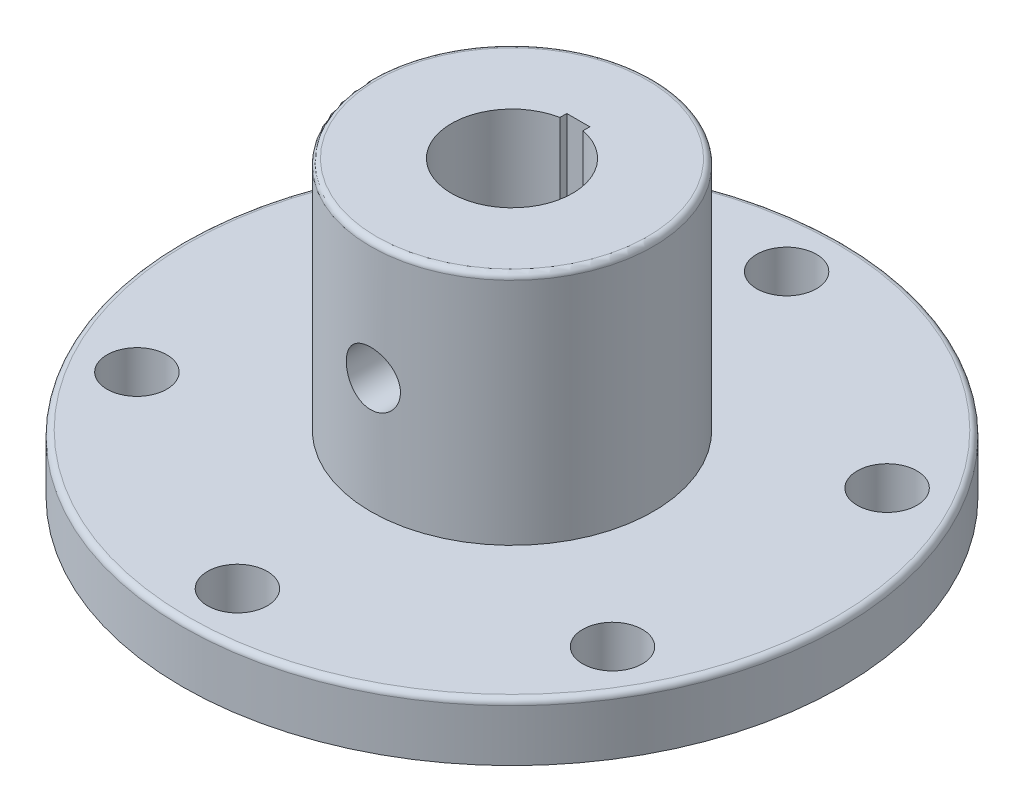
ISO-10303-21;
HEADER;
FILE_DESCRIPTION(('STEP AP214'),'2;1');
FILE_NAME('part.step','',(''),(''),'','','');
FILE_SCHEMA(('AUTOMOTIVE_DESIGN { 1 0 10303 214 1 1 1 1 }'));
ENDSEC;
DATA;
#1=APPLICATION_CONTEXT('core data for automotive mechanical design processes');
#2=APPLICATION_PROTOCOL_DEFINITION('international standard','automotive_design',2000,#1);
#3=PRODUCT_CONTEXT('',#1,'mechanical');
#4=PRODUCT('Part','Part','',(#3));
#5=PRODUCT_RELATED_PRODUCT_CATEGORY('part','',(#4));
#6=PRODUCT_DEFINITION_FORMATION('','',#4);
#7=PRODUCT_DEFINITION_CONTEXT('part definition',#1,'design');
#8=PRODUCT_DEFINITION('design','',#6,#7);
#9=PRODUCT_DEFINITION_SHAPE('','',#8);
#10=(LENGTH_UNIT() NAMED_UNIT(*) SI_UNIT(.MILLI.,.METRE.));
#11=(NAMED_UNIT(*) PLANE_ANGLE_UNIT() SI_UNIT($,.RADIAN.));
#12=(NAMED_UNIT(*) SI_UNIT($,.STERADIAN.) SOLID_ANGLE_UNIT());
#13=UNCERTAINTY_MEASURE_WITH_UNIT(LENGTH_MEASURE(1.E-05),#10,'distance_accuracy_value','');
#14=(GEOMETRIC_REPRESENTATION_CONTEXT(3) GLOBAL_UNCERTAINTY_ASSIGNED_CONTEXT((#13)) GLOBAL_UNIT_ASSIGNED_CONTEXT((#10,
#11,#12)) REPRESENTATION_CONTEXT('',''));
#15=CARTESIAN_POINT('',(0.,0.,0.));
#16=DIRECTION('',(0.,0.,1.));
#17=DIRECTION('',(1.,0.,0.));
#18=AXIS2_PLACEMENT_3D('',#15,#16,#17);
#19=CARTESIAN_POINT('',(0.,25.4,0.));
#20=DIRECTION('',(0.,-1.,0.));
#21=DIRECTION('',(0.,0.,-1.));
#22=AXIS2_PLACEMENT_3D('',#19,#20,#21);
#23=CYLINDRICAL_SURFACE('',#22,5.25);
#24=CARTESIAN_POINT('',(-2.3495,15.,4.69492808784118));
#25=CARTESIAN_POINT('',(-2.34949288735421,14.8756945065325,4.694935836284));
#26=CARTESIAN_POINT('',(-2.33957132215159,14.7511862497372,4.69993720821761));
#27=CARTESIAN_POINT('',(-2.3003208765193,14.5058455843325,4.71926659332286));
#28=CARTESIAN_POINT('',(-2.27094321450493,14.3850232157904,4.73361804815298));
#29=CARTESIAN_POINT('',(-2.19419994467508,14.1510444450422,4.76967068579204));
#30=CARTESIAN_POINT('',(-2.14691533883563,14.0378561869069,4.7913387249291));
#31=CARTESIAN_POINT('',(-2.03594368812667,13.8210479822122,4.83953301093363));
#32=CARTESIAN_POINT('',(-1.97225878555762,13.7174267883482,4.86605862314654));
#33=CARTESIAN_POINT('',(-1.82539310349536,13.5151730991631,4.92311210088569));
#34=CARTESIAN_POINT('',(-1.74120962848836,13.4173101616223,4.95378826214694));
#35=CARTESIAN_POINT('',(-1.55783507534765,13.236512161064,5.01447658382264));
#36=CARTESIAN_POINT('',(-1.45863770139583,13.1535833925281,5.04448845960026));
#37=CARTESIAN_POINT('',(-1.241800603619,13.0008637463092,5.10231707238847));
#38=CARTESIAN_POINT('',(-1.12347502920796,12.9319672225833,5.12994169594584));
#39=CARTESIAN_POINT('',(-0.875449781211427,12.8153982259397,5.17803092931463));
#40=CARTESIAN_POINT('',(-0.745755935130169,12.767714954153,5.19849918102714));
#41=CARTESIAN_POINT('',(-0.486782719503627,12.6978042742629,5.22891234419675));
#42=CARTESIAN_POINT('',(-0.357929561478004,12.674242019914,5.23940644757788));
#43=CARTESIAN_POINT('',(-0.0977009822254734,12.6488998652787,5.25070321989438));
#44=CARTESIAN_POINT('',(0.0336732175401929,12.6471096704811,5.25151046907518));
#45=CARTESIAN_POINT('',(0.285395750012746,12.664726801271,5.24364431860405));
#46=CARTESIAN_POINT('',(0.4058720800966,12.6826588456921,5.23563071022895));
#47=CARTESIAN_POINT('',(0.641893703788537,12.7366438424558,5.21196168535084));
#48=CARTESIAN_POINT('',(0.75743863136576,12.7726981373842,5.19630570266543));
#49=CARTESIAN_POINT('',(0.982458808102356,12.8622862290396,5.15853665572203));
#50=CARTESIAN_POINT('',(1.09181495172675,12.9160776421955,5.13632896679957));
#51=CARTESIAN_POINT('',(1.3002354218741,13.0393338719513,5.08756926348823));
#52=CARTESIAN_POINT('',(1.39929597064186,13.1088044122359,5.06101566359456));
#53=CARTESIAN_POINT('',(1.59269359144384,13.2678420471255,5.00367797653522));
#54=CARTESIAN_POINT('',(1.68602925145679,13.3585676618148,4.9727253911028));
#55=CARTESIAN_POINT('',(1.85663478954122,13.5543410692201,4.91158194533386));
#56=CARTESIAN_POINT('',(1.93389645399695,13.6593961389427,4.88139148132126));
#57=CARTESIAN_POINT('',(2.07331422226228,13.8864454154257,4.82387892304089));
#58=CARTESIAN_POINT('',(2.1346839325573,14.0089715667011,4.79673448354417));
#59=CARTESIAN_POINT('',(2.2354975655461,14.264148375657,4.75059570094461));
#60=CARTESIAN_POINT('',(2.27495992140187,14.3967904144606,4.73159450907578));
#61=CARTESIAN_POINT('',(2.32808071537848,14.6583734014502,4.70567311718695));
#62=CARTESIAN_POINT('',(2.34337860371551,14.7869037414304,4.69798802469881));
#63=CARTESIAN_POINT('',(2.35261012821264,15.0448974312917,4.69337448662132));
#64=CARTESIAN_POINT('',(2.34655327634646,15.1743603401432,4.6964412518629));
#65=CARTESIAN_POINT('',(2.31474827981582,15.4197506687006,4.71218643144925));
#66=CARTESIAN_POINT('',(2.29058936135858,15.5359408118542,4.72408843297877));
#67=CARTESIAN_POINT('',(2.2254595091983,15.762482694797,4.75511525761755));
#68=CARTESIAN_POINT('',(2.18448421775782,15.8728329128738,4.77424195280688));
#69=CARTESIAN_POINT('',(2.08487033035258,16.0901344618703,4.81859997319486));
#70=CARTESIAN_POINT('',(2.02552044748815,16.1967099431628,4.8440670911214));
#71=CARTESIAN_POINT('',(1.89151477557983,16.3989472133058,4.89794682062964));
#72=CARTESIAN_POINT('',(1.81685173001891,16.4946037943934,4.92636082549865));
#73=CARTESIAN_POINT('',(1.64586484024666,16.6819242137616,4.98624028882396));
#74=CARTESIAN_POINT('',(1.54814539732807,16.7723100749705,5.01773540834785));
#75=CARTESIAN_POINT('',(1.33825838275017,16.9356913028539,5.07774245142922));
#76=CARTESIAN_POINT('',(1.22608864695995,17.0086840599952,5.10625392698334));
#77=CARTESIAN_POINT('',(0.988751780791553,17.1355992543858,5.15749211271813));
#78=CARTESIAN_POINT('',(0.863473251487309,17.1893376036745,5.18016242852228));
#79=CARTESIAN_POINT('',(0.604362427400938,17.2745238931534,5.21673415126384));
#80=CARTESIAN_POINT('',(0.470536162434202,17.3059873614161,5.23064166610372));
#81=CARTESIAN_POINT('',(0.20945668062214,17.3435636876852,5.24732191408229));
#82=CARTESIAN_POINT('',(0.0825106559601721,17.351470567749,5.25088209841407));
#83=CARTESIAN_POINT('',(-0.1708990944023,17.3466980635875,5.24874587072025));
#84=CARTESIAN_POINT('',(-0.297362923085681,17.3340233540928,5.24305156068298));
#85=CARTESIAN_POINT('',(-0.540243353733003,17.2897249361331,5.22348775952621));
#86=CARTESIAN_POINT('',(-0.656855387949585,17.2589883299171,5.21000145824094));
#87=CARTESIAN_POINT('',(-0.883173870332101,17.1804835853633,5.17644691877276));
#88=CARTESIAN_POINT('',(-0.992879115257439,17.1327124890319,5.15637753750418));
#89=CARTESIAN_POINT('',(-1.20783955943962,17.0190905291212,5.11040687615306));
#90=CARTESIAN_POINT('',(-1.31266050422853,16.9525115161349,5.08428050525377));
#91=CARTESIAN_POINT('',(-1.5101030896888,16.8041634373944,5.0291761594647));
#92=CARTESIAN_POINT('',(-1.60271948416682,16.7223878754874,5.00019696756447));
#93=CARTESIAN_POINT('',(-1.78086799284568,16.5382918436735,4.93969179058311));
#94=CARTESIAN_POINT('',(-1.86524131125446,16.4348513804013,4.90814746291068));
#95=CARTESIAN_POINT('',(-2.01569191677081,16.2144802911315,4.84830462271413));
#96=CARTESIAN_POINT('',(-2.08175759503139,16.097541171917,4.82000817629702));
#97=CARTESIAN_POINT('',(-2.19369292295969,15.8521059033302,4.77011817271552));
#98=CARTESIAN_POINT('',(-2.23945891552778,15.7235543819909,4.74855918084805));
#99=CARTESIAN_POINT('',(-2.29095501308678,15.5256739075768,4.72380863770945));
#100=CARTESIAN_POINT('',(-2.30525619630081,15.4589361239713,4.71682610025299));
#101=CARTESIAN_POINT('',(-2.32801563914606,15.3242580521732,4.70563600330551));
#102=CARTESIAN_POINT('',(-2.33647827232849,15.2563187032652,4.70142636679222));
#103=CARTESIAN_POINT('',(-2.34446983294463,15.1568347671213,4.69744267166463));
#104=CARTESIAN_POINT('',(-2.34635491293909,15.1255064323804,4.69650111565107));
#105=CARTESIAN_POINT('',(-2.34887091356664,15.0627897126429,4.69524283572856));
#106=CARTESIAN_POINT('',(-2.34950179675493,15.0314013258814,4.69492613047492));
#107=CARTESIAN_POINT('',(-2.3495,15.,4.69492808784118));
#108=B_SPLINE_CURVE_WITH_KNOTS('',3,(#24,#25,#26,#27,#28,#29,#30,#31,#32,#33,#34,#35,#36,#37,
#38,#39,#40,#41,#42,#43,#44,#45,#46,#47,#48,#49,#50,#51,#52,#53,#54,#55,#56,#57,#58,#59,#60,#61,
#62,#63,#64,#65,#66,#67,#68,#69,#70,#71,#72,#73,#74,#75,#76,#77,#78,#79,#80,#81,#82,#83,#84,#85,
#86,#87,#88,#89,#90,#91,#92,#93,#94,#95,#96,#97,#98,#99,#100,#101,#102,#103,#104,#105,#106,
#107),.UNSPECIFIED.,.T.,.F.,(4,2,2,2,2,2,2,2,2,2,2,2,2,2,2,2,2,2,2,2,2,2,2,2,2,2,2,2,2,2,2,2,2,
2,2,2,2,2,2,2,2,4),(0.,0.372790612810976,0.746519466956936,1.11857757156697,1.49058710045243,
1.88692790767571,2.28343537637688,2.70032281423636,3.11699778685185,3.50911129629917,
3.90103939499522,4.26552828520791,4.6300441825409,5.00010646164806,5.37030405157852,
5.76992888154144,6.16975741607203,6.58666812768393,7.00322751089224,7.390081146283,
7.77676248846835,8.1329744145174,8.48927870645142,8.86160173198539,9.23410160124911,
9.64257920582375,10.0511180568335,10.4634647349479,10.8755236777104,11.2552786865922,
11.6349474531562,11.9973661661113,12.3598478427755,12.7389391856741,13.1181929551811,
13.527775050221,13.9376162694368,14.349526839408,14.5550991295318,14.7605172615214,
14.8546866317904,14.9488588135007),.UNSPECIFIED.);
#109=CARTESIAN_POINT('',(-2.3495,15.,4.69492808784118));
#110=VERTEX_POINT('',#109);
#111=EDGE_CURVE('E217',#110,#110,#108,.T.);
#112=ORIENTED_EDGE('',*,*,#111,.T.);
#113=EDGE_LOOP('',(#112));
#114=FACE_BOUND('',#113,.T.);
#115=DIRECTION('',(0.,-1.,0.));
#116=VECTOR('',#115,1.);
#117=CARTESIAN_POINT('',(-1.,25.4,-5.15388203202208));
#118=LINE('',#117,#116);
#119=CARTESIAN_POINT('',(-0.99999999999999,12.8739355019191,-5.15388203202208));
#120=VERTEX_POINT('',#119);
#121=CARTESIAN_POINT('',(-1.,0.,-5.15388203202208));
#122=VERTEX_POINT('',#121);
#123=EDGE_CURVE('E131',#120,#122,#118,.T.);
#124=ORIENTED_EDGE('',*,*,#123,.F.);
#125=CARTESIAN_POINT('',(-1.,12.8739355019191,-5.15388203202208));
#126=CARTESIAN_POINT('',(-1.06119947936619,12.9027227539271,-5.14201147854939));
#127=CARTESIAN_POINT('',(-1.12097908357932,12.9340665085816,-5.12927685115682));
#128=CARTESIAN_POINT('',(-1.23737961800917,13.0016075654945,-5.10244559622488));
#129=CARTESIAN_POINT('',(-1.29400173593585,13.037803025073,-5.08834948634239));
#130=CARTESIAN_POINT('',(-1.45859199486861,13.1532227104732,-5.04458761024607));
#131=CARTESIAN_POINT('',(-1.56143017186008,13.239349509596,-5.01341851219442));
#132=CARTESIAN_POINT('',(-1.7507970708801,13.4275210813298,-4.95047383171912));
#133=CARTESIAN_POINT('',(-1.83733952997427,13.5295523128802,-4.91869878521529));
#134=CARTESIAN_POINT('',(-1.99225279735714,13.747430315286,-4.85801961282309));
#135=CARTESIAN_POINT('',(-2.06062133259279,13.8632788116749,-4.82911584633498));
#136=CARTESIAN_POINT('',(-2.17729457913239,14.1067778190515,-4.7776561958054));
#137=CARTESIAN_POINT('',(-2.22549918729212,14.2344834549723,-4.75513215798233));
#138=CARTESIAN_POINT('',(-2.2991943682828,14.4975459934541,-4.71994821876514));
#139=CARTESIAN_POINT('',(-2.32470848644083,14.6328948093696,-4.70727809394145));
#140=CARTESIAN_POINT('',(-2.35041408286915,14.8938293591678,-4.69448944012305));
#141=CARTESIAN_POINT('',(-2.3527352336999,15.0191559111061,-4.6933155061049));
#142=CARTESIAN_POINT('',(-2.33746608805249,15.2682681011146,-4.70093867193292));
#143=CARTESIAN_POINT('',(-2.31987790643108,15.3920539014383,-4.70973471272471));
#144=CARTESIAN_POINT('',(-2.2669493790213,15.6285584337893,-4.73542383745824));
#145=CARTESIAN_POINT('',(-2.23249495127255,15.7415234496782,-4.75191108288829));
#146=CARTESIAN_POINT('',(-2.14756124638246,15.9601547554637,-4.79089289169742));
#147=CARTESIAN_POINT('',(-2.09707532227938,16.0658179957398,-4.81338994624181));
#148=CARTESIAN_POINT('',(-1.97707623073182,16.2755425098824,-4.86397074217414));
#149=CARTESIAN_POINT('',(-1.90640766948998,16.37887027536,-4.89234930620746));
#150=CARTESIAN_POINT('',(-1.74985899682494,16.5727928263031,-4.95050160527635));
#151=CARTESIAN_POINT('',(-1.66397975065314,16.6633883355103,-4.98027526088209));
#152=CARTESIAN_POINT('',(-1.48646351135146,16.8230739626907,-5.03595061567414));
#153=CARTESIAN_POINT('',(-1.39591039314018,16.8933294948501,-5.06196779558557));
#154=CARTESIAN_POINT('',(-1.20496027568672,17.0202459517289,-5.11081313146886));
#155=CARTESIAN_POINT('',(-1.10456254173413,17.0769058607083,-5.13364104911514));
#156=CARTESIAN_POINT('',(-1.,17.1260644980809,-5.15388203202207));
#157=B_SPLINE_CURVE_WITH_KNOTS('',3,(#125,#126,#127,#128,#129,#130,#131,#132,#133,#134,#135,
#136,#137,#138,#139,#140,#141,#142,#143,#144,#145,#146,#147,#148,#149,#150,#151,#152,#153,#154,
#155,#156),.UNSPECIFIED.,.F.,.F.,(4,2,2,2,2,2,2,2,2,2,2,2,2,2,2,4),(0.,0.205848645301979,
0.411619329551637,0.822673855865901,1.23338030219207,1.64413809234327,2.05691154502545,
2.46925617204709,2.84334613156665,3.21739635733607,3.5736212982832,3.92999413010564,
4.31348049971195,4.69694506191016,5.04830777223863,5.39969672499349),.UNSPECIFIED.);
#158=CARTESIAN_POINT('',(-1.,17.1260644980809,-5.15388203202208));
#159=VERTEX_POINT('',#158);
#160=EDGE_CURVE('E113',#120,#159,#157,.T.);
#161=ORIENTED_EDGE('',*,*,#160,.T.);
#162=CARTESIAN_POINT('',(-1.,25.4,-5.15388203202208));
#163=VERTEX_POINT('',#162);
#164=EDGE_CURVE('E111',#163,#159,#118,.T.);
#165=ORIENTED_EDGE('',*,*,#164,.F.);
#166=CARTESIAN_POINT('',(0.,25.4,0.));
#167=DIRECTION('',(0.,1.,0.));
#168=DIRECTION('',(0.,0.,1.));
#169=AXIS2_PLACEMENT_3D('',#166,#167,#168);
#170=CIRCLE('',#169,5.25);
#171=CARTESIAN_POINT('',(0.999999999999999,25.4,-5.15388203202208));
#172=VERTEX_POINT('',#171);
#173=EDGE_CURVE('E134',#163,#172,#170,.T.);
#174=ORIENTED_EDGE('',*,*,#173,.T.);
#175=DIRECTION('',(0.,-1.,0.));
#176=VECTOR('',#175,1.);
#177=CARTESIAN_POINT('',(0.999999999999999,25.4,-5.15388203202208));
#178=LINE('',#177,#176);
#179=CARTESIAN_POINT('',(1.,17.1260644980809,-5.15388203202208));
#180=VERTEX_POINT('',#179);
#181=EDGE_CURVE('E122',#180,#172,#178,.F.);
#182=ORIENTED_EDGE('',*,*,#181,.F.);
#183=CARTESIAN_POINT('',(0.999999999999999,17.1260644980809,-5.15388203202208));
#184=CARTESIAN_POINT('',(1.06119947936619,17.0972772460729,-5.14201147854939));
#185=CARTESIAN_POINT('',(1.12097908357931,17.0659334914184,-5.12927685115683));
#186=CARTESIAN_POINT('',(1.23737961800916,16.9983924345055,-5.10244559622488));
#187=CARTESIAN_POINT('',(1.29400173593584,16.962196974927,-5.08834948634239));
#188=CARTESIAN_POINT('',(1.4585919948686,16.8467772895268,-5.04458761024607));
#189=CARTESIAN_POINT('',(1.56143017186007,16.760650490404,-5.01341851219442));
#190=CARTESIAN_POINT('',(1.7507970708801,16.5724789186702,-4.95047383171912));
#191=CARTESIAN_POINT('',(1.83733952997426,16.4704476871198,-4.91869878521529));
#192=CARTESIAN_POINT('',(1.99225279735714,16.252569684714,-4.8580196128231));
#193=CARTESIAN_POINT('',(2.06062133259279,16.1367211883251,-4.82911584633498));
#194=CARTESIAN_POINT('',(2.17729457913239,15.8932221809485,-4.7776561958054));
#195=CARTESIAN_POINT('',(2.22549918729212,15.7655165450277,-4.75513215798233));
#196=CARTESIAN_POINT('',(2.2991943682828,15.5024540065459,-4.71994821876514));
#197=CARTESIAN_POINT('',(2.32470848644083,15.3671051906304,-4.70727809394145));
#198=CARTESIAN_POINT('',(2.35041408286915,15.1061706408322,-4.69448944012305));
#199=CARTESIAN_POINT('',(2.3527352336999,14.9808440888939,-4.6933155061049));
#200=CARTESIAN_POINT('',(2.33746608805249,14.7317318988854,-4.70093867193292));
#201=CARTESIAN_POINT('',(2.31987790643109,14.6079460985617,-4.70973471272471));
#202=CARTESIAN_POINT('',(2.2669493790213,14.3714415662108,-4.73542383745824));
#203=CARTESIAN_POINT('',(2.23249495127255,14.2584765503218,-4.75191108288829));
#204=CARTESIAN_POINT('',(2.14756124638246,14.0398452445363,-4.79089289169742));
#205=CARTESIAN_POINT('',(2.09707532227939,13.9341820042602,-4.81338994624181));
#206=CARTESIAN_POINT('',(1.97707623073182,13.7244574901176,-4.86397074217414));
#207=CARTESIAN_POINT('',(1.90640766948999,13.62112972464,-4.89234930620746));
#208=CARTESIAN_POINT('',(1.74985899682495,13.4272071736969,-4.95050160527634));
#209=CARTESIAN_POINT('',(1.66397975065315,13.3366116644897,-4.98027526088209));
#210=CARTESIAN_POINT('',(1.48646351135146,13.1769260373093,-5.03595061567413));
#211=CARTESIAN_POINT('',(1.39591039314019,13.1066705051499,-5.06196779558557));
#212=CARTESIAN_POINT('',(1.20496027568672,12.9797540482711,-5.11081313146886));
#213=CARTESIAN_POINT('',(1.10456254173413,12.9230941392917,-5.13364104911514));
#214=CARTESIAN_POINT('',(1.,12.8739355019191,-5.15388203202208));
#215=B_SPLINE_CURVE_WITH_KNOTS('',3,(#183,#184,#185,#186,#187,#188,#189,#190,#191,#192,#193,
#194,#195,#196,#197,#198,#199,#200,#201,#202,#203,#204,#205,#206,#207,#208,#209,#210,#211,#212,
#213,#214),.UNSPECIFIED.,.F.,.F.,(4,2,2,2,2,2,2,2,2,2,2,2,2,2,2,4),(0.,0.205848645301976,
0.411619329551632,0.8226738558659,1.23338030219206,1.64413809234327,2.05691154502546,
2.46925617204709,2.84334613156665,3.21739635733607,3.5736212982832,3.92999413010564,
4.31348049971195,4.69694506191015,5.04830777223863,5.3996967249935),.UNSPECIFIED.);
#216=CARTESIAN_POINT('',(0.999999999999999,12.8739355019191,-5.15388203202208));
#217=VERTEX_POINT('',#216);
#218=EDGE_CURVE('E103',#180,#217,#215,.T.);
#219=ORIENTED_EDGE('',*,*,#218,.T.);
#220=CARTESIAN_POINT('',(0.999999999999999,0.,-5.15388203202208));
#221=VERTEX_POINT('',#220);
#222=EDGE_CURVE('E128',#221,#217,#178,.F.);
#223=ORIENTED_EDGE('',*,*,#222,.F.);
#224=CARTESIAN_POINT('',(0.,0.,0.));
#225=DIRECTION('',(0.,1.,0.));
#226=DIRECTION('',(0.,0.,1.));
#227=AXIS2_PLACEMENT_3D('',#224,#225,#226);
#228=CIRCLE('',#227,5.25);
#229=EDGE_CURVE('E133',#122,#221,#228,.T.);
#230=ORIENTED_EDGE('',*,*,#229,.F.);
#231=EDGE_LOOP('',(#124,#161,#165,#174,#182,#219,#223,#230));
#232=FACE_BOUND('',#231,.T.);
#233=ADVANCED_FACE('F35',(#114,#232),#23,.F.);
#234=CARTESIAN_POINT('',(0.,25.4,0.));
#235=DIRECTION('',(0.,-1.,0.));
#236=DIRECTION('',(0.,0.,-1.));
#237=AXIS2_PLACEMENT_3D('',#234,#235,#236);
#238=CYLINDRICAL_SURFACE('',#237,12.25);
#239=CARTESIAN_POINT('',(0.,5.,0.));
#240=DIRECTION('',(0.,1.,0.));
#241=DIRECTION('',(0.,0.,1.));
#242=AXIS2_PLACEMENT_3D('',#239,#240,#241);
#243=CIRCLE('',#242,12.25);
#244=CARTESIAN_POINT('',(0.,5.,12.25));
#245=VERTEX_POINT('',#244);
#246=EDGE_CURVE('E140',#245,#245,#243,.T.);
#247=ORIENTED_EDGE('',*,*,#246,.T.);
#248=EDGE_LOOP('',(#247));
#249=FACE_BOUND('',#248,.T.);
#250=CARTESIAN_POINT('',(0.,24.9,0.));
#251=DIRECTION('',(0.,1.,0.));
#252=DIRECTION('',(0.,0.,1.));
#253=AXIS2_PLACEMENT_3D('',#250,#251,#252);
#254=CIRCLE('',#253,12.25);
#255=CARTESIAN_POINT('',(0.,24.9,12.25));
#256=VERTEX_POINT('',#255);
#257=EDGE_CURVE('E184',#256,#256,#254,.F.);
#258=ORIENTED_EDGE('',*,*,#257,.T.);
#259=EDGE_LOOP('',(#258));
#260=FACE_BOUND('',#259,.T.);
#261=CARTESIAN_POINT('',(-2.3495,15.,12.0225766685016));
#262=CARTESIAN_POINT('',(-2.34949504698664,14.8693364651433,12.0225792241852));
#263=CARTESIAN_POINT('',(-2.33856305282083,14.7386093107103,12.0247299218017));
#264=CARTESIAN_POINT('',(-2.29515573714834,14.4808452306569,12.033088976524));
#265=CARTESIAN_POINT('',(-2.26266248998512,14.353811467465,12.0393007098419));
#266=CARTESIAN_POINT('',(-2.17717063830551,14.107200938487,12.055053023297));
#267=CARTESIAN_POINT('',(-2.12419156994162,13.987617193821,12.0645904310808));
#268=CARTESIAN_POINT('',(-1.99928430173027,13.759041346225,12.0859157073137));
#269=CARTESIAN_POINT('',(-1.92735743815879,13.6500484971235,12.0977034170462));
#270=CARTESIAN_POINT('',(-1.76559840924849,13.4443224171205,12.1223725031353));
#271=CARTESIAN_POINT('',(-1.67556711823386,13.3477470689677,12.1352650355335));
#272=CARTESIAN_POINT('',(-1.48058520816786,13.170973928605,12.160592687512));
#273=CARTESIAN_POINT('',(-1.37563358845673,13.0907772357399,12.1730277763427));
#274=CARTESIAN_POINT('',(-1.1527503121814,12.9484303044636,12.1961592296116));
#275=CARTESIAN_POINT('',(-1.03472167652221,12.8864293235055,12.2068409131456));
#276=CARTESIAN_POINT('',(-0.789683845985917,12.7831959247974,12.2251369948476));
#277=CARTESIAN_POINT('',(-0.66267542485647,12.7419617201489,12.2327516569092));
#278=CARTESIAN_POINT('',(-0.404920240013073,12.6819216824556,12.2439769265667));
#279=CARTESIAN_POINT('',(-0.274237612303616,12.662849539046,12.2476350402121));
#280=CARTESIAN_POINT('',(-0.0114796867264842,12.6468448605073,12.2506988955152));
#281=CARTESIAN_POINT('',(0.120595486248741,12.6499103565164,12.2501050153336));
#282=CARTESIAN_POINT('',(0.380561820512192,12.6778904563441,12.2447688162567));
#283=CARTESIAN_POINT('',(0.508485128158225,12.7025182736422,12.2400809508762));
#284=CARTESIAN_POINT('',(0.758349125238763,12.7724699059771,12.2271446984939));
#285=CARTESIAN_POINT('',(0.880289589085308,12.8177945007395,12.2188961773493));
#286=CARTESIAN_POINT('',(1.11555368673449,12.9281237871392,12.1996748346488));
#287=CARTESIAN_POINT('',(1.22882258496071,12.9932423498107,12.1886863179338));
#288=CARTESIAN_POINT('',(1.44293233547798,13.1412270726457,12.1651989091385));
#289=CARTESIAN_POINT('',(1.54377186589846,13.2240951179158,12.1526998566912));
#290=CARTESIAN_POINT('',(1.73186054769819,13.4068044706307,12.1273379340086));
#291=CARTESIAN_POINT('',(1.81886576308396,13.5068967106134,12.1144724439169));
#292=CARTESIAN_POINT('',(1.97489266921171,13.7203793656276,12.0900188122153));
#293=CARTESIAN_POINT('',(2.04391407208373,13.8337699934866,12.078430691054));
#294=CARTESIAN_POINT('',(2.16208852680736,14.0709631530007,12.0578395721108));
#295=CARTESIAN_POINT('',(2.21120477054063,14.1947844669451,12.0488413723659));
#296=CARTESIAN_POINT('',(2.28786658965913,14.4491337151027,12.0345212859664));
#297=CARTESIAN_POINT('',(2.31541473186798,14.5796608492843,12.029198961854));
#298=CARTESIAN_POINT('',(2.34779936844694,14.841513091968,12.0229201592954));
#299=CARTESIAN_POINT('',(2.35298693113591,14.9727932099801,12.0218962018551));
#300=CARTESIAN_POINT('',(2.34144544993629,15.2343435074448,12.0241493082128));
#301=CARTESIAN_POINT('',(2.32471754309492,15.3646137389411,12.0274261488713));
#302=CARTESIAN_POINT('',(2.27012178342351,15.619283512459,12.0378486643735));
#303=CARTESIAN_POINT('',(2.2324391632728,15.7437242775671,12.0449604233571));
#304=CARTESIAN_POINT('',(2.13720069889962,15.9845258418962,12.0622220643179));
#305=CARTESIAN_POINT('',(2.07964333122918,16.1008860208991,12.0723721791845));
#306=CARTESIAN_POINT('',(1.94548569521362,16.3237664809372,12.0947198380405));
#307=CARTESIAN_POINT('',(1.86866436030411,16.4301513261459,12.1069405753467));
#308=CARTESIAN_POINT('',(1.69845640912243,16.6286475258375,12.131987813097));
#309=CARTESIAN_POINT('',(1.60506823113931,16.7207575331355,12.1448143705663));
#310=CARTESIAN_POINT('',(1.40280684840802,16.889407531105,12.1698455890914));
#311=CARTESIAN_POINT('',(1.29373480180205,16.9657109864034,12.1820390024736));
#312=CARTESIAN_POINT('',(1.0641158064415,17.0989097227653,12.20423870684));
#313=CARTESIAN_POINT('',(0.943569313766694,17.1558057748115,12.2142450847013));
#314=CARTESIAN_POINT('',(0.69506613015431,17.248223678139,12.2308950149354));
#315=CARTESIAN_POINT('',(0.567153279998392,17.2838600306363,12.2375565507379));
#316=CARTESIAN_POINT('',(0.307017610252305,17.3331115152568,12.2468430796185));
#317=CARTESIAN_POINT('',(0.174795267810497,17.3467290769148,12.2494685180346));
#318=CARTESIAN_POINT('',(-0.0879407808491681,17.3514686325634,12.2503776168174));
#319=CARTESIAN_POINT('',(-0.218447947420502,17.3429473221828,12.248730122283));
#320=CARTESIAN_POINT('',(-0.476134132608787,17.3044343851998,12.2414220972256));
#321=CARTESIAN_POINT('',(-0.603313186357644,17.2744429853328,12.2357616090818));
#322=CARTESIAN_POINT('',(-0.850533082721782,17.193994334222,12.2210642485117));
#323=CARTESIAN_POINT('',(-0.970587232195124,17.1435767056755,12.2120339155548));
#324=CARTESIAN_POINT('',(-1.20058450591225,17.0237502894297,12.1915726476411));
#325=CARTESIAN_POINT('',(-1.31052691034202,16.9543401511267,12.1801415419729));
#326=CARTESIAN_POINT('',(-1.51895269892293,16.7972794830654,12.1559232185078));
#327=CARTESIAN_POINT('',(-1.61724048753996,16.7093720899143,12.1431183016167));
#328=CARTESIAN_POINT('',(-1.79779283923619,16.5183435694334,12.1177050023736));
#329=CARTESIAN_POINT('',(-1.88005362071752,16.4152188616169,12.1050966670494));
#330=CARTESIAN_POINT('',(-2.02697385060943,16.1954781797016,12.0813693249795));
#331=CARTESIAN_POINT('',(-2.09145375229001,16.0787404010185,12.0702660480508));
#332=CARTESIAN_POINT('',(-2.19978258078634,15.8359114686571,12.0509961636096));
#333=CARTESIAN_POINT('',(-2.24365072737532,15.7098291559908,12.0428268219824));
#334=CARTESIAN_POINT('',(-2.30073245479513,15.4861693708413,12.0320288085738));
#335=CARTESIAN_POINT('',(-2.31898848110147,15.3898903122715,12.0285056124419));
#336=CARTESIAN_POINT('',(-2.34337393002435,15.1957527081414,12.0237786192915));
#337=CARTESIAN_POINT('',(-2.34950371083889,15.0978942093224,12.0225747537622));
#338=CARTESIAN_POINT('',(-2.3495,15.,12.0225766685016));
#339=B_SPLINE_CURVE_WITH_KNOTS('',3,(#261,#262,#263,#264,#265,#266,#267,#268,#269,#270,#271,
#272,#273,#274,#275,#276,#277,#278,#279,#280,#281,#282,#283,#284,#285,#286,#287,#288,#289,#290,
#291,#292,#293,#294,#295,#296,#297,#298,#299,#300,#301,#302,#303,#304,#305,#306,#307,#308,#309,
#310,#311,#312,#313,#314,#315,#316,#317,#318,#319,#320,#321,#322,#323,#324,#325,#326,#327,#328,
#329,#330,#331,#332,#333,#334,#335,#336,#337,#338),.UNSPECIFIED.,.T.,.F.,(4,2,2,2,2,2,2,2,2,2,2,
2,2,2,2,2,2,2,2,2,2,2,2,2,2,2,2,2,2,2,2,2,2,2,2,2,2,2,4),(0.,0.391632295677845,
0.783590596367792,1.17517602711525,1.56673384904715,1.96286034105253,2.35901341256634,
2.75833065090976,3.15761352372043,3.55204710829349,3.94644561344126,4.33567683023969,
4.72492271205461,5.11645165008007,5.5080221915761,5.90587357477851,6.30373132606507,
6.7023214652825,7.10086416100226,7.49312627832594,7.88536804459639,8.27419641042213,
8.66305458751111,9.05659756046153,9.45017765136339,9.84927873922043,10.2483639704523,
10.6452799215645,11.0421520743167,11.4326697273817,11.8231832564375,12.2129428687986,
12.6027302051219,12.9983372160488,13.3940374583348,13.7935981229606,14.1927854675576,
14.486208315083,14.7796224950419),.UNSPECIFIED.);
#340=CARTESIAN_POINT('',(-2.3495,15.,12.0225766685016));
#341=VERTEX_POINT('',#340);
#342=EDGE_CURVE('E112',#341,#341,#339,.T.);
#343=ORIENTED_EDGE('',*,*,#342,.F.);
#344=EDGE_LOOP('',(#343));
#345=FACE_BOUND('',#344,.T.);
#346=ADVANCED_FACE('F267',(#249,#260,#345),#238,.T.);
#347=CARTESIAN_POINT('',(-1.,0.,-5.75));
#348=DIRECTION('',(-1.,0.,0.));
#349=DIRECTION('',(0.,0.,1.));
#350=AXIS2_PLACEMENT_3D('',#347,#348,#349);
#351=PLANE('',#350);
#352=DIRECTION('',(0.,0.,-1.));
#353=VECTOR('',#352,1.);
#354=CARTESIAN_POINT('',(-0.99999999999999,17.1260644980809,19.65));
#355=LINE('',#354,#353);
#356=CARTESIAN_POINT('',(-1.,17.1260644980809,-5.75));
#357=VERTEX_POINT('',#356);
#358=EDGE_CURVE('E98',#357,#159,#355,.F.);
#359=ORIENTED_EDGE('',*,*,#358,.F.);
#360=DIRECTION('',(0.,1.,0.));
#361=VECTOR('',#360,1.);
#362=CARTESIAN_POINT('',(-1.,0.,-5.75));
#363=LINE('',#362,#361);
#364=CARTESIAN_POINT('',(-1.,25.4,-5.75));
#365=VERTEX_POINT('',#364);
#366=EDGE_CURVE('E108',#357,#365,#363,.T.);
#367=ORIENTED_EDGE('',*,*,#366,.T.);
#368=DIRECTION('',(0.,0.,1.));
#369=VECTOR('',#368,1.);
#370=CARTESIAN_POINT('',(-1.,25.4,-5.75));
#371=LINE('',#370,#369);
#372=EDGE_CURVE('E216',#365,#163,#371,.T.);
#373=ORIENTED_EDGE('',*,*,#372,.T.);
#374=ORIENTED_EDGE('',*,*,#164,.T.);
#375=EDGE_LOOP('',(#359,#367,#373,#374));
#376=FACE_BOUND('',#375,.T.);
#377=ADVANCED_FACE('F107',(#376),#351,.F.);
#378=DIRECTION('',(0.,0.,-1.));
#379=VECTOR('',#378,1.);
#380=CARTESIAN_POINT('',(-0.99999999999999,12.8739355019191,19.65));
#381=LINE('',#380,#379);
#382=CARTESIAN_POINT('',(-1.,12.8739355019191,-5.75));
#383=VERTEX_POINT('',#382);
#384=EDGE_CURVE('E101',#120,#383,#381,.T.);
#385=ORIENTED_EDGE('',*,*,#384,.F.);
#386=ORIENTED_EDGE('',*,*,#123,.T.);
#387=DIRECTION('',(0.,0.,1.));
#388=VECTOR('',#387,1.);
#389=CARTESIAN_POINT('',(-1.,0.,-5.75));
#390=LINE('',#389,#388);
#391=CARTESIAN_POINT('',(-1.,0.,-5.75));
#392=VERTEX_POINT('',#391);
#393=EDGE_CURVE('E213',#392,#122,#390,.T.);
#394=ORIENTED_EDGE('',*,*,#393,.F.);
#395=EDGE_CURVE('E119',#392,#383,#363,.T.);
#396=ORIENTED_EDGE('',*,*,#395,.T.);
#397=EDGE_LOOP('',(#385,#386,#394,#396));
#398=FACE_BOUND('',#397,.T.);
#399=ADVANCED_FACE('F260',(#398),#351,.F.);
#400=CARTESIAN_POINT('',(0.999999999999999,0.,-5.75));
#401=DIRECTION('',(1.,0.,0.));
#402=DIRECTION('',(0.,0.,-1.));
#403=AXIS2_PLACEMENT_3D('',#400,#401,#402);
#404=PLANE('',#403);
#405=DIRECTION('',(0.,0.,-1.));
#406=VECTOR('',#405,1.);
#407=CARTESIAN_POINT('',(1.,12.8739355019191,19.65));
#408=LINE('',#407,#406);
#409=CARTESIAN_POINT('',(0.999999999999999,12.8739355019191,-5.75));
#410=VERTEX_POINT('',#409);
#411=EDGE_CURVE('E11',#410,#217,#408,.F.);
#412=ORIENTED_EDGE('',*,*,#411,.F.);
#413=DIRECTION('',(0.,1.,0.));
#414=VECTOR('',#413,1.);
#415=CARTESIAN_POINT('',(0.999999999999999,0.,-5.75));
#416=LINE('',#415,#414);
#417=CARTESIAN_POINT('',(0.999999999999999,0.,-5.75));
#418=VERTEX_POINT('',#417);
#419=EDGE_CURVE('E120',#418,#410,#416,.T.);
#420=ORIENTED_EDGE('',*,*,#419,.F.);
#421=DIRECTION('',(0.,0.,-1.));
#422=VECTOR('',#421,1.);
#423=CARTESIAN_POINT('',(0.999999999999999,0.,-5.75));
#424=LINE('',#423,#422);
#425=EDGE_CURVE('E207',#221,#418,#424,.T.);
#426=ORIENTED_EDGE('',*,*,#425,.F.);
#427=ORIENTED_EDGE('',*,*,#222,.T.);
#428=EDGE_LOOP('',(#412,#420,#426,#427));
#429=FACE_BOUND('',#428,.T.);
#430=ADVANCED_FACE('F256',(#429),#404,.F.);
#431=DIRECTION('',(0.,0.,-1.));
#432=VECTOR('',#431,1.);
#433=CARTESIAN_POINT('',(1.,17.1260644980809,19.65));
#434=LINE('',#433,#432);
#435=CARTESIAN_POINT('',(0.999999999999999,17.1260644980809,-5.75));
#436=VERTEX_POINT('',#435);
#437=EDGE_CURVE('E43',#180,#436,#434,.T.);
#438=ORIENTED_EDGE('',*,*,#437,.F.);
#439=ORIENTED_EDGE('',*,*,#181,.T.);
#440=DIRECTION('',(0.,0.,-1.));
#441=VECTOR('',#440,1.);
#442=CARTESIAN_POINT('',(1.,25.4,0.));
#443=LINE('',#442,#441);
#444=CARTESIAN_POINT('',(0.999999999999999,25.4,-5.75));
#445=VERTEX_POINT('',#444);
#446=EDGE_CURVE('E193',#172,#445,#443,.T.);
#447=ORIENTED_EDGE('',*,*,#446,.T.);
#448=EDGE_CURVE('E123',#436,#445,#416,.T.);
#449=ORIENTED_EDGE('',*,*,#448,.F.);
#450=EDGE_LOOP('',(#438,#439,#447,#449));
#451=FACE_BOUND('',#450,.T.);
#452=ADVANCED_FACE('F203',(#451),#404,.F.);
#453=CARTESIAN_POINT('',(0.,5.,-23.8125));
#454=DIRECTION('',(0.,-1.,0.));
#455=DIRECTION('',(0.,0.,-1.));
#456=AXIS2_PLACEMENT_3D('',#453,#454,#455);
#457=CYLINDRICAL_SURFACE('',#456,2.5908);
#458=CARTESIAN_POINT('',(0.,5.,-23.8125));
#459=DIRECTION('',(0.,1.,0.));
#460=DIRECTION('',(0.,0.,1.));
#461=AXIS2_PLACEMENT_3D('',#458,#459,#460);
#462=CIRCLE('',#461,2.5908);
#463=CARTESIAN_POINT('',(0.,5.,-21.2217));
#464=VERTEX_POINT('',#463);
#465=EDGE_CURVE('E159',#464,#464,#462,.T.);
#466=ORIENTED_EDGE('',*,*,#465,.T.);
#467=EDGE_LOOP('',(#466));
#468=FACE_BOUND('',#467,.T.);
#469=CARTESIAN_POINT('',(0.,0.,-23.8125));
#470=DIRECTION('',(0.,1.,0.));
#471=DIRECTION('',(0.,0.,1.));
#472=AXIS2_PLACEMENT_3D('',#469,#470,#471);
#473=CIRCLE('',#472,2.5908);
#474=CARTESIAN_POINT('',(0.,0.,-21.2217));
#475=VERTEX_POINT('',#474);
#476=EDGE_CURVE('E177',#475,#475,#473,.T.);
#477=ORIENTED_EDGE('',*,*,#476,.F.);
#478=EDGE_LOOP('',(#477));
#479=FACE_BOUND('',#478,.T.);
#480=ADVANCED_FACE('F305',(#468,#479),#457,.F.);
#481=CARTESIAN_POINT('',(20.6222299276174,5.,-11.9062500000009));
#482=DIRECTION('',(0.,-1.,0.));
#483=DIRECTION('',(0.,0.,-1.));
#484=AXIS2_PLACEMENT_3D('',#481,#482,#483);
#485=CYLINDRICAL_SURFACE('',#484,2.59080000000029);
#486=CARTESIAN_POINT('',(20.6222299276174,5.,-11.9062500000009));
#487=DIRECTION('',(0.,1.,0.));
#488=DIRECTION('',(0.,0.,1.));
#489=AXIS2_PLACEMENT_3D('',#486,#487,#488);
#490=CIRCLE('',#489,2.59080000000029);
#491=CARTESIAN_POINT('',(20.6222299276174,5.,-9.31545000000059));
#492=VERTEX_POINT('',#491);
#493=EDGE_CURVE('E156',#492,#492,#490,.T.);
#494=ORIENTED_EDGE('',*,*,#493,.T.);
#495=EDGE_LOOP('',(#494));
#496=FACE_BOUND('',#495,.T.);
#497=CARTESIAN_POINT('',(20.6222299276174,0.,-11.9062500000009));
#498=DIRECTION('',(0.,1.,0.));
#499=DIRECTION('',(0.,0.,1.));
#500=AXIS2_PLACEMENT_3D('',#497,#498,#499);
#501=CIRCLE('',#500,2.59080000000029);
#502=CARTESIAN_POINT('',(20.6222299276174,0.,-9.31545000000059));
#503=VERTEX_POINT('',#502);
#504=EDGE_CURVE('E174',#503,#503,#501,.T.);
#505=ORIENTED_EDGE('',*,*,#504,.F.);
#506=EDGE_LOOP('',(#505));
#507=FACE_BOUND('',#506,.T.);
#508=ADVANCED_FACE('F308',(#496,#507),#485,.F.);
#509=CARTESIAN_POINT('',(20.6222299276185,5.,11.9062499999991));
#510=DIRECTION('',(0.,-1.,0.));
#511=DIRECTION('',(0.,0.,-1.));
#512=AXIS2_PLACEMENT_3D('',#509,#510,#511);
#513=CYLINDRICAL_SURFACE('',#512,2.59080000000131);
#514=CARTESIAN_POINT('',(20.6222299276185,5.,11.9062499999991));
#515=DIRECTION('',(0.,1.,0.));
#516=DIRECTION('',(0.,0.,1.));
#517=AXIS2_PLACEMENT_3D('',#514,#515,#516);
#518=CIRCLE('',#517,2.59080000000131);
#519=CARTESIAN_POINT('',(20.6222299276185,5.,14.4970500000004));
#520=VERTEX_POINT('',#519);
#521=EDGE_CURVE('E153',#520,#520,#518,.T.);
#522=ORIENTED_EDGE('',*,*,#521,.T.);
#523=EDGE_LOOP('',(#522));
#524=FACE_BOUND('',#523,.T.);
#525=CARTESIAN_POINT('',(20.6222299276185,0.,11.9062499999991));
#526=DIRECTION('',(0.,1.,0.));
#527=DIRECTION('',(0.,0.,1.));
#528=AXIS2_PLACEMENT_3D('',#525,#526,#527);
#529=CIRCLE('',#528,2.59080000000131);
#530=CARTESIAN_POINT('',(20.6222299276185,0.,14.4970500000004));
#531=VERTEX_POINT('',#530);
#532=EDGE_CURVE('E171',#531,#531,#529,.T.);
#533=ORIENTED_EDGE('',*,*,#532,.F.);
#534=EDGE_LOOP('',(#533));
#535=FACE_BOUND('',#534,.T.);
#536=ADVANCED_FACE('F312',(#524,#535),#513,.F.);
#537=CARTESIAN_POINT('',(2.02454348705355E-12,5.,23.8125));
#538=DIRECTION('',(0.,-1.,0.));
#539=DIRECTION('',(0.,0.,-1.));
#540=AXIS2_PLACEMENT_3D('',#537,#538,#539);
#541=CYLINDRICAL_SURFACE('',#540,2.5908000000021);
#542=CARTESIAN_POINT('',(2.02454348705355E-12,5.,23.8125));
#543=DIRECTION('',(0.,1.,0.));
#544=DIRECTION('',(0.,0.,1.));
#545=AXIS2_PLACEMENT_3D('',#542,#543,#544);
#546=CIRCLE('',#545,2.5908000000021);
#547=CARTESIAN_POINT('',(2.02454348705355E-12,5.,26.4033000000021));
#548=VERTEX_POINT('',#547);
#549=EDGE_CURVE('E150',#548,#548,#546,.T.);
#550=ORIENTED_EDGE('',*,*,#549,.T.);
#551=EDGE_LOOP('',(#550));
#552=FACE_BOUND('',#551,.T.);
#553=CARTESIAN_POINT('',(2.02454348705355E-12,0.,23.8125));
#554=DIRECTION('',(0.,1.,0.));
#555=DIRECTION('',(0.,0.,1.));
#556=AXIS2_PLACEMENT_3D('',#553,#554,#555);
#557=CIRCLE('',#556,2.5908000000021);
#558=CARTESIAN_POINT('',(2.02454348705355E-12,0.,26.4033000000021));
#559=VERTEX_POINT('',#558);
#560=EDGE_CURVE('E168',#559,#559,#557,.T.);
#561=ORIENTED_EDGE('',*,*,#560,.F.);
#562=EDGE_LOOP('',(#561));
#563=FACE_BOUND('',#562,.T.);
#564=ADVANCED_FACE('F316',(#552,#563),#541,.F.);
#565=CARTESIAN_POINT('',(-20.6222299276154,5.,11.9062500000009));
#566=DIRECTION('',(0.,-1.,0.));
#567=DIRECTION('',(0.,0.,-1.));
#568=AXIS2_PLACEMENT_3D('',#565,#566,#567);
#569=CYLINDRICAL_SURFACE('',#568,2.59080000000193);
#570=CARTESIAN_POINT('',(-20.6222299276154,5.,11.9062500000009));
#571=DIRECTION('',(0.,1.,0.));
#572=DIRECTION('',(0.,0.,1.));
#573=AXIS2_PLACEMENT_3D('',#570,#571,#572);
#574=CIRCLE('',#573,2.59080000000193);
#575=CARTESIAN_POINT('',(-20.6222299276154,5.,14.4970500000028));
#576=VERTEX_POINT('',#575);
#577=EDGE_CURVE('E147',#576,#576,#574,.T.);
#578=ORIENTED_EDGE('',*,*,#577,.T.);
#579=EDGE_LOOP('',(#578));
#580=FACE_BOUND('',#579,.T.);
#581=CARTESIAN_POINT('',(-20.6222299276154,0.,11.9062500000009));
#582=DIRECTION('',(0.,1.,0.));
#583=DIRECTION('',(0.,0.,1.));
#584=AXIS2_PLACEMENT_3D('',#581,#582,#583);
#585=CIRCLE('',#584,2.59080000000193);
#586=CARTESIAN_POINT('',(-20.6222299276154,0.,14.4970500000028));
#587=VERTEX_POINT('',#586);
#588=EDGE_CURVE('E165',#587,#587,#585,.T.);
#589=ORIENTED_EDGE('',*,*,#588,.F.);
#590=EDGE_LOOP('',(#589));
#591=FACE_BOUND('',#590,.T.);
#592=ADVANCED_FACE('F320',(#580,#591),#569,.F.);
#593=CARTESIAN_POINT('',(-20.6222299276164,5.,-11.9062499999991));
#594=DIRECTION('',(0.,-1.,0.));
#595=DIRECTION('',(0.,0.,-1.));
#596=AXIS2_PLACEMENT_3D('',#593,#594,#595);
#597=CYLINDRICAL_SURFACE('',#596,2.59080000000102);
#598=CARTESIAN_POINT('',(-20.6222299276164,5.,-11.9062499999991));
#599=DIRECTION('',(0.,1.,0.));
#600=DIRECTION('',(0.,0.,1.));
#601=AXIS2_PLACEMENT_3D('',#598,#599,#600);
#602=CIRCLE('',#601,2.59080000000102);
#603=CARTESIAN_POINT('',(-20.6222299276164,5.,-9.31544999999808));
#604=VERTEX_POINT('',#603);
#605=EDGE_CURVE('E143',#604,#604,#602,.T.);
#606=ORIENTED_EDGE('',*,*,#605,.T.);
#607=EDGE_LOOP('',(#606));
#608=FACE_BOUND('',#607,.T.);
#609=CARTESIAN_POINT('',(-20.6222299276164,0.,-11.9062499999991));
#610=DIRECTION('',(0.,1.,0.));
#611=DIRECTION('',(0.,0.,1.));
#612=AXIS2_PLACEMENT_3D('',#609,#610,#611);
#613=CIRCLE('',#612,2.59080000000102);
#614=CARTESIAN_POINT('',(-20.6222299276164,0.,-9.31544999999808));
#615=VERTEX_POINT('',#614);
#616=EDGE_CURVE('E137',#615,#615,#613,.T.);
#617=ORIENTED_EDGE('',*,*,#616,.F.);
#618=EDGE_LOOP('',(#617));
#619=FACE_BOUND('',#618,.T.);
#620=ADVANCED_FACE('F303',(#608,#619),#597,.F.);
#621=CARTESIAN_POINT('',(0.,5.,0.));
#622=DIRECTION('',(0.,-1.,0.));
#623=DIRECTION('',(0.,0.,-1.));
#624=AXIS2_PLACEMENT_3D('',#621,#622,#623);
#625=CYLINDRICAL_SURFACE('',#624,28.575);
#626=CARTESIAN_POINT('',(0.,4.5,0.));
#627=DIRECTION('',(0.,1.,0.));
#628=DIRECTION('',(0.,0.,1.));
#629=AXIS2_PLACEMENT_3D('',#626,#627,#628);
#630=CIRCLE('',#629,28.575);
#631=CARTESIAN_POINT('',(0.,4.5,28.575));
#632=VERTEX_POINT('',#631);
#633=EDGE_CURVE('E190',#632,#632,#630,.F.);
#634=ORIENTED_EDGE('',*,*,#633,.T.);
#635=EDGE_LOOP('',(#634));
#636=FACE_BOUND('',#635,.T.);
#637=CARTESIAN_POINT('',(0.,0.,0.));
#638=DIRECTION('',(0.,1.,0.));
#639=DIRECTION('',(0.,0.,1.));
#640=AXIS2_PLACEMENT_3D('',#637,#638,#639);
#641=CIRCLE('',#640,28.575);
#642=CARTESIAN_POINT('',(0.,0.,28.575));
#643=VERTEX_POINT('',#642);
#644=EDGE_CURVE('E144',#643,#643,#641,.T.);
#645=ORIENTED_EDGE('',*,*,#644,.T.);
#646=EDGE_LOOP('',(#645));
#647=FACE_BOUND('',#646,.T.);
#648=ADVANCED_FACE('F297',(#636,#647),#625,.T.);
#649=CARTESIAN_POINT('',(0.,5.,0.));
#650=DIRECTION('',(0.,1.,0.));
#651=DIRECTION('',(0.,0.,1.));
#652=AXIS2_PLACEMENT_3D('',#649,#650,#651);
#653=PLANE('',#652);
#654=CARTESIAN_POINT('',(0.,5.,0.));
#655=DIRECTION('',(0.,1.,0.));
#656=DIRECTION('',(0.,0.,1.));
#657=AXIS2_PLACEMENT_3D('',#654,#655,#656);
#658=CIRCLE('',#657,28.075);
#659=CARTESIAN_POINT('',(0.,5.,28.075));
#660=VERTEX_POINT('',#659);
#661=EDGE_CURVE('E187',#660,#660,#658,.T.);
#662=ORIENTED_EDGE('',*,*,#661,.T.);
#663=EDGE_LOOP('',(#662));
#664=FACE_BOUND('',#663,.T.);
#665=ORIENTED_EDGE('',*,*,#246,.F.);
#666=EDGE_LOOP('',(#665));
#667=FACE_BOUND('',#666,.T.);
#668=ORIENTED_EDGE('',*,*,#605,.F.);
#669=EDGE_LOOP('',(#668));
#670=FACE_BOUND('',#669,.T.);
#671=ORIENTED_EDGE('',*,*,#577,.F.);
#672=EDGE_LOOP('',(#671));
#673=FACE_BOUND('',#672,.T.);
#674=ORIENTED_EDGE('',*,*,#549,.F.);
#675=EDGE_LOOP('',(#674));
#676=FACE_BOUND('',#675,.T.);
#677=ORIENTED_EDGE('',*,*,#521,.F.);
#678=EDGE_LOOP('',(#677));
#679=FACE_BOUND('',#678,.T.);
#680=ORIENTED_EDGE('',*,*,#493,.F.);
#681=EDGE_LOOP('',(#680));
#682=FACE_BOUND('',#681,.T.);
#683=ORIENTED_EDGE('',*,*,#465,.F.);
#684=EDGE_LOOP('',(#683));
#685=FACE_BOUND('',#684,.T.);
#686=ADVANCED_FACE('F287',(#664,#667,#670,#673,#676,#679,#682,#685),#653,.T.);
#687=CARTESIAN_POINT('',(0.,0.,0.));
#688=DIRECTION('',(0.,1.,0.));
#689=DIRECTION('',(0.,0.,1.));
#690=AXIS2_PLACEMENT_3D('',#687,#688,#689);
#691=PLANE('',#690);
#692=ORIENTED_EDGE('',*,*,#616,.T.);
#693=EDGE_LOOP('',(#692));
#694=FACE_BOUND('',#693,.T.);
#695=ORIENTED_EDGE('',*,*,#588,.T.);
#696=EDGE_LOOP('',(#695));
#697=FACE_BOUND('',#696,.T.);
#698=ORIENTED_EDGE('',*,*,#560,.T.);
#699=EDGE_LOOP('',(#698));
#700=FACE_BOUND('',#699,.T.);
#701=ORIENTED_EDGE('',*,*,#532,.T.);
#702=EDGE_LOOP('',(#701));
#703=FACE_BOUND('',#702,.T.);
#704=ORIENTED_EDGE('',*,*,#504,.T.);
#705=EDGE_LOOP('',(#704));
#706=FACE_BOUND('',#705,.T.);
#707=ORIENTED_EDGE('',*,*,#476,.T.);
#708=EDGE_LOOP('',(#707));
#709=FACE_BOUND('',#708,.T.);
#710=ORIENTED_EDGE('',*,*,#644,.F.);
#711=EDGE_LOOP('',(#710));
#712=FACE_BOUND('',#711,.T.);
#713=DIRECTION('',(-1.,0.,0.));
#714=VECTOR('',#713,1.);
#715=CARTESIAN_POINT('',(0.999999999999999,0.,-5.75));
#716=LINE('',#715,#714);
#717=EDGE_CURVE('E205',#418,#392,#716,.T.);
#718=ORIENTED_EDGE('',*,*,#717,.T.);
#719=ORIENTED_EDGE('',*,*,#393,.T.);
#720=ORIENTED_EDGE('',*,*,#229,.T.);
#721=ORIENTED_EDGE('',*,*,#425,.T.);
#722=EDGE_LOOP('',(#718,#719,#720,#721));
#723=FACE_BOUND('',#722,.T.);
#724=ADVANCED_FACE('F257',(#694,#697,#700,#703,#706,#709,#712,#723),#691,.F.);
#725=CARTESIAN_POINT('',(0.,25.4,0.));
#726=DIRECTION('',(0.,1.,0.));
#727=DIRECTION('',(0.,0.,1.));
#728=AXIS2_PLACEMENT_3D('',#725,#726,#727);
#729=PLANE('',#728);
#730=ORIENTED_EDGE('',*,*,#372,.F.);
#731=DIRECTION('',(-1.,0.,0.));
#732=VECTOR('',#731,1.);
#733=CARTESIAN_POINT('',(0.999999999999999,25.4,-5.75));
#734=LINE('',#733,#732);
#735=EDGE_CURVE('E117',#445,#365,#734,.T.);
#736=ORIENTED_EDGE('',*,*,#735,.F.);
#737=ORIENTED_EDGE('',*,*,#446,.F.);
#738=ORIENTED_EDGE('',*,*,#173,.F.);
#739=EDGE_LOOP('',(#730,#736,#737,#738));
#740=FACE_BOUND('',#739,.T.);
#741=CARTESIAN_POINT('',(0.,25.4,0.));
#742=DIRECTION('',(0.,1.,0.));
#743=DIRECTION('',(0.,0.,1.));
#744=AXIS2_PLACEMENT_3D('',#741,#742,#743);
#745=CIRCLE('',#744,11.75);
#746=CARTESIAN_POINT('',(0.,25.4,11.75));
#747=VERTEX_POINT('',#746);
#748=EDGE_CURVE('E162',#747,#747,#745,.T.);
#749=ORIENTED_EDGE('',*,*,#748,.T.);
#750=EDGE_LOOP('',(#749));
#751=FACE_BOUND('',#750,.T.);
#752=ADVANCED_FACE('F278',(#740,#751),#729,.T.);
#753=CARTESIAN_POINT('',(0.,24.9,0.));
#754=DIRECTION('',(0.,1.,0.));
#755=DIRECTION('',(0.,0.,1.));
#756=AXIS2_PLACEMENT_3D('',#753,#754,#755);
#757=TOROIDAL_SURFACE('',#756,11.75,0.5);
#758=ORIENTED_EDGE('',*,*,#257,.F.);
#759=EDGE_LOOP('',(#758));
#760=FACE_BOUND('',#759,.T.);
#761=ORIENTED_EDGE('',*,*,#748,.F.);
#762=EDGE_LOOP('',(#761));
#763=FACE_BOUND('',#762,.T.);
#764=ADVANCED_FACE('F280',(#760,#763),#757,.T.);
#765=CARTESIAN_POINT('',(0.,4.5,0.));
#766=DIRECTION('',(0.,1.,0.));
#767=DIRECTION('',(0.,0.,1.));
#768=AXIS2_PLACEMENT_3D('',#765,#766,#767);
#769=TOROIDAL_SURFACE('',#768,28.075,0.5);
#770=ORIENTED_EDGE('',*,*,#633,.F.);
#771=EDGE_LOOP('',(#770));
#772=FACE_BOUND('',#771,.T.);
#773=ORIENTED_EDGE('',*,*,#661,.F.);
#774=EDGE_LOOP('',(#773));
#775=FACE_BOUND('',#774,.T.);
#776=ADVANCED_FACE('F37',(#772,#775),#769,.T.);
#777=CARTESIAN_POINT('',(0.999999999999999,0.,-5.75));
#778=DIRECTION('',(0.,0.,-1.));
#779=DIRECTION('',(-1.,0.,0.));
#780=AXIS2_PLACEMENT_3D('',#777,#778,#779);
#781=PLANE('',#780);
#782=ORIENTED_EDGE('',*,*,#366,.F.);
#783=CARTESIAN_POINT('',(0.,15.,-5.75));
#784=DIRECTION('',(0.,0.,1.));
#785=DIRECTION('',(1.,0.,0.));
#786=AXIS2_PLACEMENT_3D('',#783,#784,#785);
#787=CIRCLE('',#786,2.3495);
#788=EDGE_CURVE('E50',#357,#383,#787,.T.);
#789=ORIENTED_EDGE('',*,*,#788,.T.);
#790=ORIENTED_EDGE('',*,*,#395,.F.);
#791=ORIENTED_EDGE('',*,*,#717,.F.);
#792=ORIENTED_EDGE('',*,*,#419,.T.);
#793=EDGE_CURVE('E57',#410,#436,#787,.T.);
#794=ORIENTED_EDGE('',*,*,#793,.T.);
#795=ORIENTED_EDGE('',*,*,#448,.T.);
#796=ORIENTED_EDGE('',*,*,#735,.T.);
#797=EDGE_LOOP('',(#782,#789,#790,#791,#792,#794,#795,#796));
#798=FACE_BOUND('',#797,.T.);
#799=ADVANCED_FACE('F115',(#798),#781,.F.);
#800=CARTESIAN_POINT('',(0.,15.,19.65));
#801=DIRECTION('',(0.,0.,-1.));
#802=DIRECTION('',(-1.,0.,0.));
#803=AXIS2_PLACEMENT_3D('',#800,#801,#802);
#804=CYLINDRICAL_SURFACE('',#803,2.3495);
#805=ORIENTED_EDGE('',*,*,#411,.T.);
#806=ORIENTED_EDGE('',*,*,#218,.F.);
#807=ORIENTED_EDGE('',*,*,#437,.T.);
#808=ORIENTED_EDGE('',*,*,#793,.F.);
#809=EDGE_LOOP('',(#805,#806,#807,#808));
#810=FACE_BOUND('',#809,.T.);
#811=ADVANCED_FACE('F198',(#810),#804,.F.);
#812=ORIENTED_EDGE('',*,*,#358,.T.);
#813=ORIENTED_EDGE('',*,*,#160,.F.);
#814=ORIENTED_EDGE('',*,*,#384,.T.);
#815=ORIENTED_EDGE('',*,*,#788,.F.);
#816=EDGE_LOOP('',(#812,#813,#814,#815));
#817=FACE_BOUND('',#816,.T.);
#818=ADVANCED_FACE('F97',(#817),#804,.F.);
#819=ORIENTED_EDGE('',*,*,#111,.F.);
#820=EDGE_LOOP('',(#819));
#821=FACE_BOUND('',#820,.T.);
#822=ORIENTED_EDGE('',*,*,#342,.T.);
#823=EDGE_LOOP('',(#822));
#824=FACE_BOUND('',#823,.T.);
#825=ADVANCED_FACE('F233',(#821,#824),#804,.F.);
#826=CLOSED_SHELL('',(#233,#346,#377,#399,#430,#452,#480,#508,#536,#564,#592,#620,#648,#686,
#724,#752,#764,#776,#799,#811,#818,#825));
#827=MANIFOLD_SOLID_BREP('B2',#826);
#828=ADVANCED_BREP_SHAPE_REPRESENTATION('',(#18,#827),#14);
#829=SHAPE_DEFINITION_REPRESENTATION(#9,#828);
ENDSEC;
END-ISO-10303-21;
